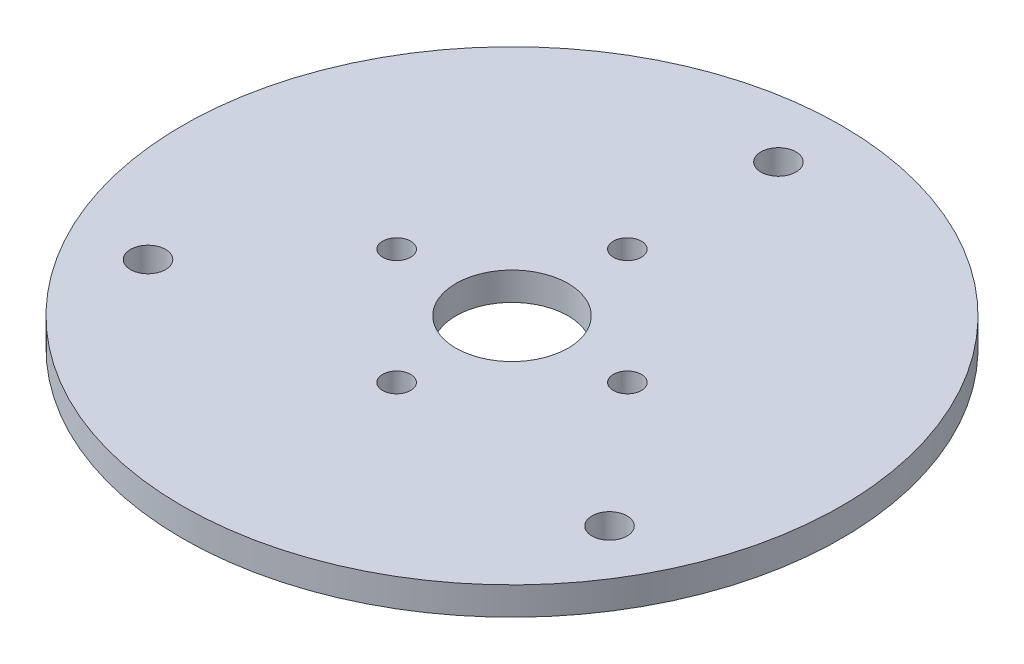
ISO-10303-21;
HEADER;
FILE_DESCRIPTION(('STEP AP214'),'2;1');
FILE_NAME('part.step','',(''),(''),'','','');
FILE_SCHEMA(('AUTOMOTIVE_DESIGN { 1 0 10303 214 1 1 1 1 }'));
ENDSEC;
DATA;
#1=APPLICATION_CONTEXT('core data for automotive mechanical design processes');
#2=APPLICATION_PROTOCOL_DEFINITION('international standard','automotive_design',2000,#1);
#3=PRODUCT_CONTEXT('',#1,'mechanical');
#4=PRODUCT('Part','Part','',(#3));
#5=PRODUCT_RELATED_PRODUCT_CATEGORY('part','',(#4));
#6=PRODUCT_DEFINITION_FORMATION('','',#4);
#7=PRODUCT_DEFINITION_CONTEXT('part definition',#1,'design');
#8=PRODUCT_DEFINITION('design','',#6,#7);
#9=PRODUCT_DEFINITION_SHAPE('','',#8);
#10=(LENGTH_UNIT() NAMED_UNIT(*) SI_UNIT(.MILLI.,.METRE.));
#11=(NAMED_UNIT(*) PLANE_ANGLE_UNIT() SI_UNIT($,.RADIAN.));
#12=(NAMED_UNIT(*) SI_UNIT($,.STERADIAN.) SOLID_ANGLE_UNIT());
#13=UNCERTAINTY_MEASURE_WITH_UNIT(LENGTH_MEASURE(1.E-05),#10,'distance_accuracy_value','');
#14=(GEOMETRIC_REPRESENTATION_CONTEXT(3) GLOBAL_UNCERTAINTY_ASSIGNED_CONTEXT((#13)) GLOBAL_UNIT_ASSIGNED_CONTEXT((#10,
#11,#12)) REPRESENTATION_CONTEXT('',''));
#15=CARTESIAN_POINT('',(0.,0.,0.));
#16=DIRECTION('',(0.,0.,1.));
#17=DIRECTION('',(1.,0.,0.));
#18=AXIS2_PLACEMENT_3D('',#15,#16,#17);
#19=CARTESIAN_POINT('',(0.,2.,0.));
#20=DIRECTION('',(0.,-1.,0.));
#21=DIRECTION('',(0.,0.,-1.));
#22=AXIS2_PLACEMENT_3D('',#19,#20,#21);
#23=CYLINDRICAL_SURFACE('',#22,23.5);
#24=CARTESIAN_POINT('',(0.,2.,0.));
#25=DIRECTION('',(0.,1.,0.));
#26=DIRECTION('',(0.,0.,1.));
#27=AXIS2_PLACEMENT_3D('',#24,#25,#26);
#28=CIRCLE('',#27,23.5);
#29=CARTESIAN_POINT('',(0.,2.,23.5));
#30=VERTEX_POINT('',#29);
#31=EDGE_CURVE('E10',#30,#30,#28,.T.);
#32=ORIENTED_EDGE('',*,*,#31,.F.);
#33=EDGE_LOOP('',(#32));
#34=FACE_BOUND('',#33,.T.);
#35=CARTESIAN_POINT('',(0.,0.,0.));
#36=DIRECTION('',(0.,1.,0.));
#37=DIRECTION('',(0.,0.,1.));
#38=AXIS2_PLACEMENT_3D('',#35,#36,#37);
#39=CIRCLE('',#38,23.5);
#40=CARTESIAN_POINT('',(0.,0.,23.5));
#41=VERTEX_POINT('',#40);
#42=EDGE_CURVE('E40',#41,#41,#39,.T.);
#43=ORIENTED_EDGE('',*,*,#42,.T.);
#44=EDGE_LOOP('',(#43));
#45=FACE_BOUND('',#44,.T.);
#46=ADVANCED_FACE('F37',(#34,#45),#23,.T.);
#47=CARTESIAN_POINT('',(0.,2.,0.));
#48=DIRECTION('',(0.,1.,0.));
#49=DIRECTION('',(0.,0.,1.));
#50=AXIS2_PLACEMENT_3D('',#47,#48,#49);
#51=PLANE('',#50);
#52=CARTESIAN_POINT('',(0.,2.,0.));
#53=DIRECTION('',(0.,1.,0.));
#54=DIRECTION('',(0.,0.,1.));
#55=AXIS2_PLACEMENT_3D('',#52,#53,#54);
#56=CIRCLE('',#55,4.);
#57=CARTESIAN_POINT('',(0.,2.,4.));
#58=VERTEX_POINT('',#57);
#59=EDGE_CURVE('E107',#58,#58,#56,.F.);
#60=ORIENTED_EDGE('',*,*,#59,.T.);
#61=EDGE_LOOP('',(#60));
#62=FACE_BOUND('',#61,.T.);
#63=CARTESIAN_POINT('',(0.,2.,-19.));
#64=DIRECTION('',(0.,1.,0.));
#65=DIRECTION('',(0.,0.,1.));
#66=AXIS2_PLACEMENT_3D('',#63,#64,#65);
#67=CIRCLE('',#66,1.25);
#68=CARTESIAN_POINT('',(0.,2.,-17.75));
#69=VERTEX_POINT('',#68);
#70=EDGE_CURVE('E68',#69,#69,#67,.T.);
#71=ORIENTED_EDGE('',*,*,#70,.F.);
#72=EDGE_LOOP('',(#71));
#73=FACE_BOUND('',#72,.T.);
#74=CARTESIAN_POINT('',(-16.4544826719031,2.,9.50000000000071));
#75=DIRECTION('',(0.,1.,0.));
#76=DIRECTION('',(0.,0.,1.));
#77=AXIS2_PLACEMENT_3D('',#74,#75,#76);
#78=CIRCLE('',#77,1.25000000000154);
#79=CARTESIAN_POINT('',(-16.4544826719031,2.,10.7500000000022));
#80=VERTEX_POINT('',#79);
#81=EDGE_CURVE('E85',#80,#80,#78,.T.);
#82=ORIENTED_EDGE('',*,*,#81,.F.);
#83=EDGE_LOOP('',(#82));
#84=FACE_BOUND('',#83,.T.);
#85=CARTESIAN_POINT('',(16.4544826719055,2.,9.4999999999993));
#86=DIRECTION('',(0.,1.,0.));
#87=DIRECTION('',(0.,0.,1.));
#88=AXIS2_PLACEMENT_3D('',#85,#86,#87);
#89=CIRCLE('',#88,1.25000000000104);
#90=CARTESIAN_POINT('',(16.4544826719055,2.,10.7500000000003));
#91=VERTEX_POINT('',#90);
#92=EDGE_CURVE('E94',#91,#91,#89,.T.);
#93=ORIENTED_EDGE('',*,*,#92,.F.);
#94=EDGE_LOOP('',(#93));
#95=FACE_BOUND('',#94,.T.);
#96=CARTESIAN_POINT('',(0.,2.,-8.2270625170551));
#97=DIRECTION('',(0.,1.,0.));
#98=DIRECTION('',(0.,0.,1.));
#99=AXIS2_PLACEMENT_3D('',#96,#97,#98);
#100=CIRCLE('',#99,1.);
#101=CARTESIAN_POINT('',(0.,2.,-7.2270625170551));
#102=VERTEX_POINT('',#101);
#103=EDGE_CURVE('E60',#102,#102,#100,.T.);
#104=ORIENTED_EDGE('',*,*,#103,.F.);
#105=EDGE_LOOP('',(#104));
#106=FACE_BOUND('',#105,.T.);
#107=CARTESIAN_POINT('',(8.22706251705533,2.,-2.32315893458824E-13));
#108=DIRECTION('',(0.,1.,0.));
#109=DIRECTION('',(0.,0.,1.));
#110=AXIS2_PLACEMENT_3D('',#107,#108,#109);
#111=CIRCLE('',#110,1.00000000000018);
#112=CARTESIAN_POINT('',(8.22706251705533,2.,0.99999999999995));
#113=VERTEX_POINT('',#112);
#114=EDGE_CURVE('E51',#113,#113,#111,.T.);
#115=ORIENTED_EDGE('',*,*,#114,.F.);
#116=EDGE_LOOP('',(#115));
#117=FACE_BOUND('',#116,.T.);
#118=CARTESIAN_POINT('',(4.64631786917647E-13,2.,8.2270625170551));
#119=DIRECTION('',(0.,1.,0.));
#120=DIRECTION('',(0.,0.,1.));
#121=AXIS2_PLACEMENT_3D('',#118,#119,#120);
#122=CIRCLE('',#121,1.0000000000005);
#123=CARTESIAN_POINT('',(4.64631786917647E-13,2.,9.22706251705559));
#124=VERTEX_POINT('',#123);
#125=EDGE_CURVE('E78',#124,#124,#122,.T.);
#126=ORIENTED_EDGE('',*,*,#125,.F.);
#127=EDGE_LOOP('',(#126));
#128=FACE_BOUND('',#127,.T.);
#129=CARTESIAN_POINT('',(-8.22706251705486,2.,2.33323418036613E-13));
#130=DIRECTION('',(0.,1.,0.));
#131=DIRECTION('',(0.,0.,1.));
#132=AXIS2_PLACEMENT_3D('',#129,#130,#131);
#133=CIRCLE('',#132,1.00000000000037);
#134=CARTESIAN_POINT('',(-8.22706251705486,2.,1.00000000000061));
#135=VERTEX_POINT('',#134);
#136=EDGE_CURVE('E69',#135,#135,#133,.T.);
#137=ORIENTED_EDGE('',*,*,#136,.F.);
#138=EDGE_LOOP('',(#137));
#139=FACE_BOUND('',#138,.T.);
#140=ORIENTED_EDGE('',*,*,#31,.T.);
#141=EDGE_LOOP('',(#140));
#142=FACE_BOUND('',#141,.T.);
#143=ADVANCED_FACE('F121',(#62,#73,#84,#95,#106,#117,#128,#139,#142),#51,.T.);
#144=CARTESIAN_POINT('',(0.,0.,0.));
#145=DIRECTION('',(0.,1.,0.));
#146=DIRECTION('',(0.,0.,1.));
#147=AXIS2_PLACEMENT_3D('',#144,#145,#146);
#148=PLANE('',#147);
#149=CARTESIAN_POINT('',(0.,0.,0.));
#150=DIRECTION('',(0.,-1.,0.));
#151=DIRECTION('',(0.,0.,-1.));
#152=AXIS2_PLACEMENT_3D('',#149,#150,#151);
#153=CIRCLE('',#152,4.);
#154=CARTESIAN_POINT('',(0.,0.,-4.));
#155=VERTEX_POINT('',#154);
#156=EDGE_CURVE('E90',#155,#155,#153,.T.);
#157=ORIENTED_EDGE('',*,*,#156,.F.);
#158=EDGE_LOOP('',(#157));
#159=FACE_BOUND('',#158,.T.);
#160=CARTESIAN_POINT('',(0.,0.,-19.));
#161=DIRECTION('',(0.,1.,0.));
#162=DIRECTION('',(0.,0.,1.));
#163=AXIS2_PLACEMENT_3D('',#160,#161,#162);
#164=CIRCLE('',#163,1.25);
#165=CARTESIAN_POINT('',(0.,0.,-17.75));
#166=VERTEX_POINT('',#165);
#167=EDGE_CURVE('E49',#166,#166,#164,.T.);
#168=ORIENTED_EDGE('',*,*,#167,.T.);
#169=EDGE_LOOP('',(#168));
#170=FACE_BOUND('',#169,.T.);
#171=CARTESIAN_POINT('',(-16.4544826719031,0.,9.50000000000071));
#172=DIRECTION('',(0.,1.,0.));
#173=DIRECTION('',(0.,0.,1.));
#174=AXIS2_PLACEMENT_3D('',#171,#172,#173);
#175=CIRCLE('',#174,1.25000000000154);
#176=CARTESIAN_POINT('',(-16.4544826719031,0.,10.7500000000022));
#177=VERTEX_POINT('',#176);
#178=EDGE_CURVE('E89',#177,#177,#175,.T.);
#179=ORIENTED_EDGE('',*,*,#178,.T.);
#180=EDGE_LOOP('',(#179));
#181=FACE_BOUND('',#180,.T.);
#182=CARTESIAN_POINT('',(16.4544826719055,0.,9.4999999999993));
#183=DIRECTION('',(0.,1.,0.));
#184=DIRECTION('',(0.,0.,1.));
#185=AXIS2_PLACEMENT_3D('',#182,#183,#184);
#186=CIRCLE('',#185,1.25000000000104);
#187=CARTESIAN_POINT('',(16.4544826719055,0.,10.7500000000003));
#188=VERTEX_POINT('',#187);
#189=EDGE_CURVE('E74',#188,#188,#186,.T.);
#190=ORIENTED_EDGE('',*,*,#189,.T.);
#191=EDGE_LOOP('',(#190));
#192=FACE_BOUND('',#191,.T.);
#193=CARTESIAN_POINT('',(0.,0.,-8.2270625170551));
#194=DIRECTION('',(0.,1.,0.));
#195=DIRECTION('',(0.,0.,1.));
#196=AXIS2_PLACEMENT_3D('',#193,#194,#195);
#197=CIRCLE('',#196,1.);
#198=CARTESIAN_POINT('',(0.,0.,-7.2270625170551));
#199=VERTEX_POINT('',#198);
#200=EDGE_CURVE('E64',#199,#199,#197,.T.);
#201=ORIENTED_EDGE('',*,*,#200,.T.);
#202=EDGE_LOOP('',(#201));
#203=FACE_BOUND('',#202,.T.);
#204=CARTESIAN_POINT('',(8.22706251705533,0.,-2.32315893458824E-13));
#205=DIRECTION('',(0.,1.,0.));
#206=DIRECTION('',(0.,0.,1.));
#207=AXIS2_PLACEMENT_3D('',#204,#205,#206);
#208=CIRCLE('',#207,1.00000000000018);
#209=CARTESIAN_POINT('',(8.22706251705533,0.,0.99999999999995));
#210=VERTEX_POINT('',#209);
#211=EDGE_CURVE('E55',#210,#210,#208,.T.);
#212=ORIENTED_EDGE('',*,*,#211,.T.);
#213=EDGE_LOOP('',(#212));
#214=FACE_BOUND('',#213,.T.);
#215=CARTESIAN_POINT('',(4.64631786917647E-13,0.,8.2270625170551));
#216=DIRECTION('',(0.,1.,0.));
#217=DIRECTION('',(0.,0.,1.));
#218=AXIS2_PLACEMENT_3D('',#215,#216,#217);
#219=CIRCLE('',#218,1.0000000000005);
#220=CARTESIAN_POINT('',(4.64631786917647E-13,0.,9.22706251705559));
#221=VERTEX_POINT('',#220);
#222=EDGE_CURVE('E56',#221,#221,#219,.T.);
#223=ORIENTED_EDGE('',*,*,#222,.T.);
#224=EDGE_LOOP('',(#223));
#225=FACE_BOUND('',#224,.T.);
#226=CARTESIAN_POINT('',(-8.22706251705486,0.,2.33323418036613E-13));
#227=DIRECTION('',(0.,1.,0.));
#228=DIRECTION('',(0.,0.,1.));
#229=AXIS2_PLACEMENT_3D('',#226,#227,#228);
#230=CIRCLE('',#229,1.00000000000037);
#231=CARTESIAN_POINT('',(-8.22706251705486,0.,1.00000000000061));
#232=VERTEX_POINT('',#231);
#233=EDGE_CURVE('E73',#232,#232,#230,.T.);
#234=ORIENTED_EDGE('',*,*,#233,.T.);
#235=EDGE_LOOP('',(#234));
#236=FACE_BOUND('',#235,.T.);
#237=ORIENTED_EDGE('',*,*,#42,.F.);
#238=EDGE_LOOP('',(#237));
#239=FACE_BOUND('',#238,.T.);
#240=ADVANCED_FACE('F117',(#159,#170,#181,#192,#203,#214,#225,#236,#239),#148,.F.);
#241=CARTESIAN_POINT('',(-8.22706251705486,0.,2.33323418036613E-13));
#242=DIRECTION('',(0.,1.,0.));
#243=DIRECTION('',(0.,0.,1.));
#244=AXIS2_PLACEMENT_3D('',#241,#242,#243);
#245=CYLINDRICAL_SURFACE('',#244,1.00000000000037);
#246=ORIENTED_EDGE('',*,*,#233,.F.);
#247=EDGE_LOOP('',(#246));
#248=FACE_BOUND('',#247,.T.);
#249=ORIENTED_EDGE('',*,*,#136,.T.);
#250=EDGE_LOOP('',(#249));
#251=FACE_BOUND('',#250,.T.);
#252=ADVANCED_FACE('F120',(#248,#251),#245,.F.);
#253=CARTESIAN_POINT('',(4.64631786917647E-13,0.,8.2270625170551));
#254=DIRECTION('',(0.,1.,0.));
#255=DIRECTION('',(0.,0.,1.));
#256=AXIS2_PLACEMENT_3D('',#253,#254,#255);
#257=CYLINDRICAL_SURFACE('',#256,1.0000000000005);
#258=ORIENTED_EDGE('',*,*,#222,.F.);
#259=EDGE_LOOP('',(#258));
#260=FACE_BOUND('',#259,.T.);
#261=ORIENTED_EDGE('',*,*,#125,.T.);
#262=EDGE_LOOP('',(#261));
#263=FACE_BOUND('',#262,.T.);
#264=ADVANCED_FACE('F153',(#260,#263),#257,.F.);
#265=CARTESIAN_POINT('',(8.22706251705533,0.,-2.32315893458824E-13));
#266=DIRECTION('',(0.,1.,0.));
#267=DIRECTION('',(0.,0.,1.));
#268=AXIS2_PLACEMENT_3D('',#265,#266,#267);
#269=CYLINDRICAL_SURFACE('',#268,1.00000000000018);
#270=ORIENTED_EDGE('',*,*,#211,.F.);
#271=EDGE_LOOP('',(#270));
#272=FACE_BOUND('',#271,.T.);
#273=ORIENTED_EDGE('',*,*,#114,.T.);
#274=EDGE_LOOP('',(#273));
#275=FACE_BOUND('',#274,.T.);
#276=ADVANCED_FACE('F149',(#272,#275),#269,.F.);
#277=CARTESIAN_POINT('',(0.,0.,-8.2270625170551));
#278=DIRECTION('',(0.,1.,0.));
#279=DIRECTION('',(0.,0.,1.));
#280=AXIS2_PLACEMENT_3D('',#277,#278,#279);
#281=CYLINDRICAL_SURFACE('',#280,1.);
#282=ORIENTED_EDGE('',*,*,#200,.F.);
#283=EDGE_LOOP('',(#282));
#284=FACE_BOUND('',#283,.T.);
#285=ORIENTED_EDGE('',*,*,#103,.T.);
#286=EDGE_LOOP('',(#285));
#287=FACE_BOUND('',#286,.T.);
#288=ADVANCED_FACE('F152',(#284,#287),#281,.F.);
#289=CARTESIAN_POINT('',(16.4544826719055,0.,9.4999999999993));
#290=DIRECTION('',(0.,1.,0.));
#291=DIRECTION('',(0.,0.,1.));
#292=AXIS2_PLACEMENT_3D('',#289,#290,#291);
#293=CYLINDRICAL_SURFACE('',#292,1.25000000000104);
#294=ORIENTED_EDGE('',*,*,#189,.F.);
#295=EDGE_LOOP('',(#294));
#296=FACE_BOUND('',#295,.T.);
#297=ORIENTED_EDGE('',*,*,#92,.T.);
#298=EDGE_LOOP('',(#297));
#299=FACE_BOUND('',#298,.T.);
#300=ADVANCED_FACE('F157',(#296,#299),#293,.F.);
#301=CARTESIAN_POINT('',(-16.4544826719031,0.,9.50000000000071));
#302=DIRECTION('',(0.,1.,0.));
#303=DIRECTION('',(0.,0.,1.));
#304=AXIS2_PLACEMENT_3D('',#301,#302,#303);
#305=CYLINDRICAL_SURFACE('',#304,1.25000000000154);
#306=ORIENTED_EDGE('',*,*,#178,.F.);
#307=EDGE_LOOP('',(#306));
#308=FACE_BOUND('',#307,.T.);
#309=ORIENTED_EDGE('',*,*,#81,.T.);
#310=EDGE_LOOP('',(#309));
#311=FACE_BOUND('',#310,.T.);
#312=ADVANCED_FACE('F165',(#308,#311),#305,.F.);
#313=CARTESIAN_POINT('',(0.,0.,-19.));
#314=DIRECTION('',(0.,1.,0.));
#315=DIRECTION('',(0.,0.,1.));
#316=AXIS2_PLACEMENT_3D('',#313,#314,#315);
#317=CYLINDRICAL_SURFACE('',#316,1.25);
#318=ORIENTED_EDGE('',*,*,#167,.F.);
#319=EDGE_LOOP('',(#318));
#320=FACE_BOUND('',#319,.T.);
#321=ORIENTED_EDGE('',*,*,#70,.T.);
#322=EDGE_LOOP('',(#321));
#323=FACE_BOUND('',#322,.T.);
#324=ADVANCED_FACE('F168',(#320,#323),#317,.F.);
#325=CARTESIAN_POINT('',(0.,2.001,0.));
#326=DIRECTION('',(0.,-1.,0.));
#327=DIRECTION('',(0.,0.,-1.));
#328=AXIS2_PLACEMENT_3D('',#325,#326,#327);
#329=CYLINDRICAL_SURFACE('',#328,4.);
#330=ORIENTED_EDGE('',*,*,#59,.F.);
#331=EDGE_LOOP('',(#330));
#332=FACE_BOUND('',#331,.T.);
#333=ORIENTED_EDGE('',*,*,#156,.T.);
#334=EDGE_LOOP('',(#333));
#335=FACE_BOUND('',#334,.T.);
#336=ADVANCED_FACE('F115',(#332,#335),#329,.F.);
#337=CLOSED_SHELL('',(#46,#143,#240,#252,#264,#276,#288,#300,#312,#324,#336));
#338=MANIFOLD_SOLID_BREP('B2',#337);
#339=ADVANCED_BREP_SHAPE_REPRESENTATION('',(#18,#338),#14);
#340=SHAPE_DEFINITION_REPRESENTATION(#9,#339);
ENDSEC;
END-ISO-10303-21;
